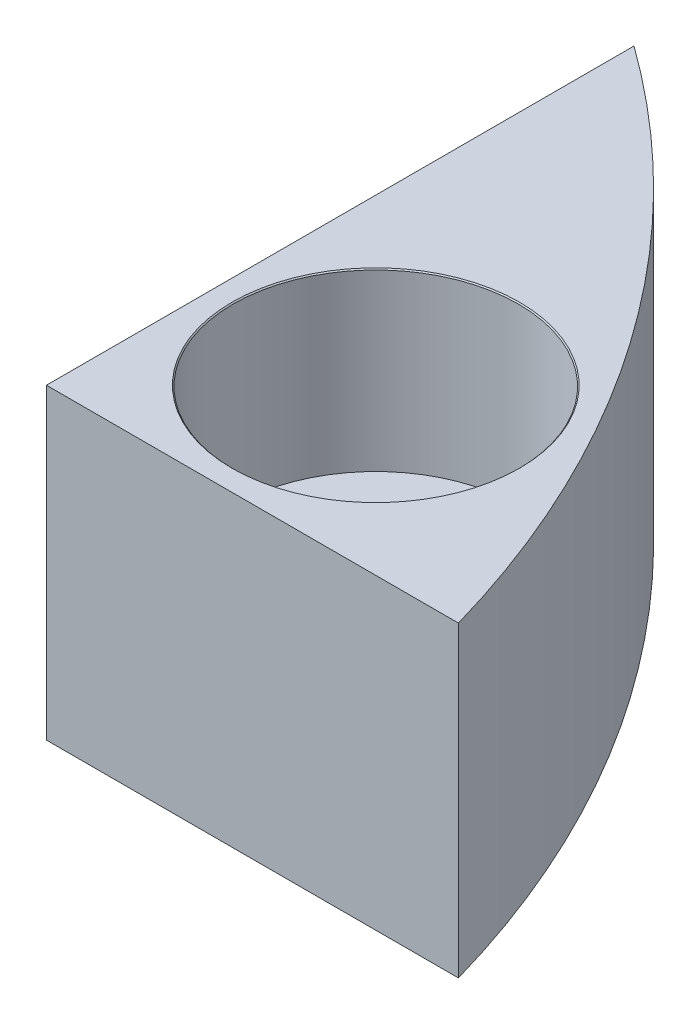
ISO-10303-21;
HEADER;
FILE_DESCRIPTION(('STEP AP214'),'2;1');
FILE_NAME('part.step','',(''),(''),'','','');
FILE_SCHEMA(('AUTOMOTIVE_DESIGN { 1 0 10303 214 1 1 1 1 }'));
ENDSEC;
DATA;
#1=APPLICATION_CONTEXT('core data for automotive mechanical design processes');
#2=APPLICATION_PROTOCOL_DEFINITION('international standard','automotive_design',2000,#1);
#3=PRODUCT_CONTEXT('',#1,'mechanical');
#4=PRODUCT('Part','Part','',(#3));
#5=PRODUCT_RELATED_PRODUCT_CATEGORY('part','',(#4));
#6=PRODUCT_DEFINITION_FORMATION('','',#4);
#7=PRODUCT_DEFINITION_CONTEXT('part definition',#1,'design');
#8=PRODUCT_DEFINITION('design','',#6,#7);
#9=PRODUCT_DEFINITION_SHAPE('','',#8);
#10=(LENGTH_UNIT() NAMED_UNIT(*) SI_UNIT(.MILLI.,.METRE.));
#11=(NAMED_UNIT(*) PLANE_ANGLE_UNIT() SI_UNIT($,.RADIAN.));
#12=(NAMED_UNIT(*) SI_UNIT($,.STERADIAN.) SOLID_ANGLE_UNIT());
#13=UNCERTAINTY_MEASURE_WITH_UNIT(LENGTH_MEASURE(1.E-05),#10,'distance_accuracy_value','');
#14=(GEOMETRIC_REPRESENTATION_CONTEXT(3) GLOBAL_UNCERTAINTY_ASSIGNED_CONTEXT((#13)) GLOBAL_UNIT_ASSIGNED_CONTEXT((#10,
#11,#12)) REPRESENTATION_CONTEXT('',''));
#15=CARTESIAN_POINT('',(0.,0.,0.));
#16=DIRECTION('',(0.,0.,1.));
#17=DIRECTION('',(1.,0.,0.));
#18=AXIS2_PLACEMENT_3D('',#15,#16,#17);
#19=CARTESIAN_POINT('',(0.,0.,0.));
#20=DIRECTION('',(0.,-1.,0.));
#21=DIRECTION('',(0.,0.,-1.));
#22=AXIS2_PLACEMENT_3D('',#19,#20,#21);
#23=PLANE('',#22);
#24=DIRECTION('',(0.,0.,1.));
#25=VECTOR('',#24,1.);
#26=CARTESIAN_POINT('',(14.6530398304193,0.,-6.87500000000009));
#27=LINE('',#26,#25);
#28=CARTESIAN_POINT('',(14.6530398304193,0.,-20.2555775955204));
#29=VERTEX_POINT('',#28);
#30=CARTESIAN_POINT('',(14.6530398304193,0.,-6.87500000000009));
#31=VERTEX_POINT('',#30);
#32=EDGE_CURVE('E90',#29,#31,#27,.T.);
#33=ORIENTED_EDGE('',*,*,#32,.F.);
#34=CARTESIAN_POINT('',(0.,0.,0.));
#35=DIRECTION('',(0.,1.,0.));
#36=DIRECTION('',(0.,0.,-1.));
#37=AXIS2_PLACEMENT_3D('',#34,#35,#36);
#38=CIRCLE('',#37,25.);
#39=CARTESIAN_POINT('',(24.0361056537867,0.,-6.87500000000009));
#40=VERTEX_POINT('',#39);
#41=EDGE_CURVE('E74',#40,#29,#38,.T.);
#42=ORIENTED_EDGE('',*,*,#41,.F.);
#43=DIRECTION('',(1.,0.,0.));
#44=VECTOR('',#43,1.);
#45=CARTESIAN_POINT('',(14.6530398304193,0.,-6.87500000000009));
#46=LINE('',#45,#44);
#47=EDGE_CURVE('E69',#31,#40,#46,.T.);
#48=ORIENTED_EDGE('',*,*,#47,.F.);
#49=EDGE_LOOP('',(#33,#42,#48));
#50=FACE_BOUND('',#49,.T.);
#51=CARTESIAN_POINT('',(18.4030398304193,0.,-10.6250000000001));
#52=DIRECTION('',(0.,-1.,0.));
#53=DIRECTION('',(0.,0.,-1.));
#54=AXIS2_PLACEMENT_3D('',#51,#52,#53);
#55=CIRCLE('',#54,1.6);
#56=CARTESIAN_POINT('',(18.4030398304193,0.,-12.2250000000001));
#57=VERTEX_POINT('',#56);
#58=EDGE_CURVE('E114',#57,#57,#55,.F.);
#59=ORIENTED_EDGE('',*,*,#58,.T.);
#60=EDGE_LOOP('',(#59));
#61=FACE_BOUND('',#60,.T.);
#62=ADVANCED_FACE('F39',(#50,#61),#23,.T.);
#63=CARTESIAN_POINT('',(14.6530398304193,7.,-6.87500000000009));
#64=DIRECTION('',(1.,0.,0.));
#65=DIRECTION('',(0.,0.,-1.));
#66=AXIS2_PLACEMENT_3D('',#63,#64,#65);
#67=PLANE('',#66);
#68=ORIENTED_EDGE('',*,*,#32,.T.);
#69=DIRECTION('',(0.,-1.,0.));
#70=VECTOR('',#69,1.);
#71=CARTESIAN_POINT('',(14.6530398304193,7.,-6.87500000000009));
#72=LINE('',#71,#70);
#73=CARTESIAN_POINT('',(14.6530398304193,7.,-6.87500000000009));
#74=VERTEX_POINT('',#73);
#75=EDGE_CURVE('E11',#74,#31,#72,.T.);
#76=ORIENTED_EDGE('',*,*,#75,.F.);
#77=DIRECTION('',(0.,0.,1.));
#78=VECTOR('',#77,1.);
#79=CARTESIAN_POINT('',(14.6530398304193,7.,-6.87500000000009));
#80=LINE('',#79,#78);
#81=CARTESIAN_POINT('',(14.6530398304193,7.,-20.2555775955204));
#82=VERTEX_POINT('',#81);
#83=EDGE_CURVE('E82',#82,#74,#80,.T.);
#84=ORIENTED_EDGE('',*,*,#83,.F.);
#85=DIRECTION('',(0.,-1.,0.));
#86=VECTOR('',#85,1.);
#87=CARTESIAN_POINT('',(14.6530398304193,7.,-20.2555775955204));
#88=LINE('',#87,#86);
#89=EDGE_CURVE('E91',#82,#29,#88,.T.);
#90=ORIENTED_EDGE('',*,*,#89,.T.);
#91=EDGE_LOOP('',(#68,#76,#84,#90));
#92=FACE_BOUND('',#91,.T.);
#93=ADVANCED_FACE('F41',(#92),#67,.F.);
#94=CARTESIAN_POINT('',(14.6530398304193,7.,-6.87500000000009));
#95=DIRECTION('',(0.,0.,-1.));
#96=DIRECTION('',(-1.,0.,0.));
#97=AXIS2_PLACEMENT_3D('',#94,#95,#96);
#98=PLANE('',#97);
#99=ORIENTED_EDGE('',*,*,#47,.T.);
#100=DIRECTION('',(0.,-1.,0.));
#101=VECTOR('',#100,1.);
#102=CARTESIAN_POINT('',(24.0361056537867,7.,-6.87500000000009));
#103=LINE('',#102,#101);
#104=CARTESIAN_POINT('',(24.0361056537867,7.,-6.87500000000009));
#105=VERTEX_POINT('',#104);
#106=EDGE_CURVE('E49',#105,#40,#103,.T.);
#107=ORIENTED_EDGE('',*,*,#106,.F.);
#108=DIRECTION('',(1.,0.,0.));
#109=VECTOR('',#108,1.);
#110=CARTESIAN_POINT('',(14.6530398304193,7.,-6.87500000000009));
#111=LINE('',#110,#109);
#112=EDGE_CURVE('E77',#74,#105,#111,.T.);
#113=ORIENTED_EDGE('',*,*,#112,.F.);
#114=ORIENTED_EDGE('',*,*,#75,.T.);
#115=EDGE_LOOP('',(#99,#107,#113,#114));
#116=FACE_BOUND('',#115,.T.);
#117=ADVANCED_FACE('F78',(#116),#98,.F.);
#118=CARTESIAN_POINT('',(0.,7.,0.));
#119=DIRECTION('',(0.,-1.,0.));
#120=DIRECTION('',(0.,0.,-1.));
#121=AXIS2_PLACEMENT_3D('',#118,#119,#120);
#122=CYLINDRICAL_SURFACE('',#121,25.);
#123=ORIENTED_EDGE('',*,*,#41,.T.);
#124=ORIENTED_EDGE('',*,*,#89,.F.);
#125=CARTESIAN_POINT('',(0.,7.,0.));
#126=DIRECTION('',(0.,1.,0.));
#127=DIRECTION('',(0.,0.,-1.));
#128=AXIS2_PLACEMENT_3D('',#125,#126,#127);
#129=CIRCLE('',#128,25.);
#130=EDGE_CURVE('E57',#105,#82,#129,.T.);
#131=ORIENTED_EDGE('',*,*,#130,.F.);
#132=ORIENTED_EDGE('',*,*,#106,.T.);
#133=EDGE_LOOP('',(#123,#124,#131,#132));
#134=FACE_BOUND('',#133,.T.);
#135=ADVANCED_FACE('F108',(#134),#122,.T.);
#136=CARTESIAN_POINT('',(0.,7.,0.));
#137=DIRECTION('',(0.,-1.,0.));
#138=DIRECTION('',(0.,0.,-1.));
#139=AXIS2_PLACEMENT_3D('',#136,#137,#138);
#140=PLANE('',#139);
#141=CARTESIAN_POINT('',(18.4030398304193,7.,-10.6250000000001));
#142=DIRECTION('',(0.,1.,0.));
#143=DIRECTION('',(0.,0.,1.));
#144=AXIS2_PLACEMENT_3D('',#141,#142,#143);
#145=CIRCLE('',#144,3.275);
#146=CARTESIAN_POINT('',(18.4030398304193,7.,-7.35000000000009));
#147=VERTEX_POINT('',#146);
#148=EDGE_CURVE('E118',#147,#147,#145,.T.);
#149=ORIENTED_EDGE('',*,*,#148,.F.);
#150=EDGE_LOOP('',(#149));
#151=FACE_BOUND('',#150,.T.);
#152=ORIENTED_EDGE('',*,*,#83,.T.);
#153=ORIENTED_EDGE('',*,*,#112,.T.);
#154=ORIENTED_EDGE('',*,*,#130,.T.);
#155=EDGE_LOOP('',(#152,#153,#154));
#156=FACE_BOUND('',#155,.T.);
#157=ADVANCED_FACE('F85',(#151,#156),#140,.F.);
#158=CARTESIAN_POINT('',(18.4030398304193,7.,-10.6250000000001));
#159=DIRECTION('',(0.,1.,0.));
#160=DIRECTION('',(0.,0.,1.));
#161=AXIS2_PLACEMENT_3D('',#158,#159,#160);
#162=CYLINDRICAL_SURFACE('',#161,1.6);
#163=ORIENTED_EDGE('',*,*,#58,.F.);
#164=EDGE_LOOP('',(#163));
#165=FACE_BOUND('',#164,.T.);
#166=CARTESIAN_POINT('',(18.4030398304193,2.975,-10.6250000000001));
#167=DIRECTION('',(0.,1.,0.));
#168=DIRECTION('',(0.,0.,1.));
#169=AXIS2_PLACEMENT_3D('',#166,#167,#168);
#170=CIRCLE('',#169,1.6);
#171=CARTESIAN_POINT('',(18.4030398304193,2.975,-9.0250000000001));
#172=VERTEX_POINT('',#171);
#173=EDGE_CURVE('E117',#172,#172,#170,.T.);
#174=ORIENTED_EDGE('',*,*,#173,.T.);
#175=EDGE_LOOP('',(#174));
#176=FACE_BOUND('',#175,.T.);
#177=ADVANCED_FACE('F156',(#165,#176),#162,.F.);
#178=CARTESIAN_POINT('',(18.4030398304193,3.,-10.6250000000001));
#179=DIRECTION('',(0.,1.,0.));
#180=DIRECTION('',(0.,0.,1.));
#181=AXIS2_PLACEMENT_3D('',#178,#179,#180);
#182=CONICAL_SURFACE('',#181,1.625,0.785398163397483);
#183=ORIENTED_EDGE('',*,*,#173,.F.);
#184=EDGE_LOOP('',(#183));
#185=FACE_BOUND('',#184,.T.);
#186=CARTESIAN_POINT('',(18.4030398304193,3.,-10.6250000000001));
#187=DIRECTION('',(0.,1.,0.));
#188=DIRECTION('',(0.,0.,1.));
#189=AXIS2_PLACEMENT_3D('',#186,#187,#188);
#190=CIRCLE('',#189,1.625);
#191=CARTESIAN_POINT('',(18.4030398304193,3.,-9.0000000000001));
#192=VERTEX_POINT('',#191);
#193=EDGE_CURVE('E123',#192,#192,#190,.T.);
#194=ORIENTED_EDGE('',*,*,#193,.T.);
#195=EDGE_LOOP('',(#194));
#196=FACE_BOUND('',#195,.T.);
#197=ADVANCED_FACE('F135',(#185,#196),#182,.F.);
#198=CARTESIAN_POINT('',(20.0280398304193,3.,-10.6250000000001));
#199=DIRECTION('',(0.,-1.,0.));
#200=DIRECTION('',(0.,0.,-1.));
#201=AXIS2_PLACEMENT_3D('',#198,#199,#200);
#202=PLANE('',#201);
#203=ORIENTED_EDGE('',*,*,#193,.F.);
#204=EDGE_LOOP('',(#203));
#205=FACE_BOUND('',#204,.T.);
#206=CARTESIAN_POINT('',(18.4030398304193,3.,-10.6250000000001));
#207=DIRECTION('',(0.,1.,0.));
#208=DIRECTION('',(0.,0.,1.));
#209=AXIS2_PLACEMENT_3D('',#206,#207,#208);
#210=CIRCLE('',#209,3.25);
#211=CARTESIAN_POINT('',(18.4030398304193,3.,-7.3750000000001));
#212=VERTEX_POINT('',#211);
#213=EDGE_CURVE('E100',#212,#212,#210,.T.);
#214=ORIENTED_EDGE('',*,*,#213,.T.);
#215=EDGE_LOOP('',(#214));
#216=FACE_BOUND('',#215,.T.);
#217=ADVANCED_FACE('F137',(#205,#216),#202,.F.);
#218=CARTESIAN_POINT('',(18.4030398304193,7.,-10.6250000000001));
#219=DIRECTION('',(0.,1.,0.));
#220=DIRECTION('',(0.,0.,1.));
#221=AXIS2_PLACEMENT_3D('',#218,#219,#220);
#222=CYLINDRICAL_SURFACE('',#221,3.25);
#223=ORIENTED_EDGE('',*,*,#213,.F.);
#224=EDGE_LOOP('',(#223));
#225=FACE_BOUND('',#224,.T.);
#226=CARTESIAN_POINT('',(18.4030398304193,6.975,-10.6250000000001));
#227=DIRECTION('',(0.,1.,0.));
#228=DIRECTION('',(0.,0.,1.));
#229=AXIS2_PLACEMENT_3D('',#226,#227,#228);
#230=CIRCLE('',#229,3.25);
#231=CARTESIAN_POINT('',(18.4030398304193,6.975,-7.3750000000001));
#232=VERTEX_POINT('',#231);
#233=EDGE_CURVE('E94',#232,#232,#230,.T.);
#234=ORIENTED_EDGE('',*,*,#233,.T.);
#235=EDGE_LOOP('',(#234));
#236=FACE_BOUND('',#235,.T.);
#237=ADVANCED_FACE('F140',(#225,#236),#222,.F.);
#238=CARTESIAN_POINT('',(18.4030398304193,7.,-10.6250000000001));
#239=DIRECTION('',(0.,1.,0.));
#240=DIRECTION('',(0.,0.,1.));
#241=AXIS2_PLACEMENT_3D('',#238,#239,#240);
#242=CONICAL_SURFACE('',#241,3.275,0.785398163397396);
#243=ORIENTED_EDGE('',*,*,#233,.F.);
#244=EDGE_LOOP('',(#243));
#245=FACE_BOUND('',#244,.T.);
#246=ORIENTED_EDGE('',*,*,#148,.T.);
#247=EDGE_LOOP('',(#246));
#248=FACE_BOUND('',#247,.T.);
#249=ADVANCED_FACE('F146',(#245,#248),#242,.F.);
#250=CLOSED_SHELL('',(#62,#93,#117,#135,#157,#177,#197,#217,#237,#249));
#251=MANIFOLD_SOLID_BREP('B2',#250);
#252=ADVANCED_BREP_SHAPE_REPRESENTATION('',(#18,#251),#14);
#253=SHAPE_DEFINITION_REPRESENTATION(#9,#252);
ENDSEC;
END-ISO-10303-21;
